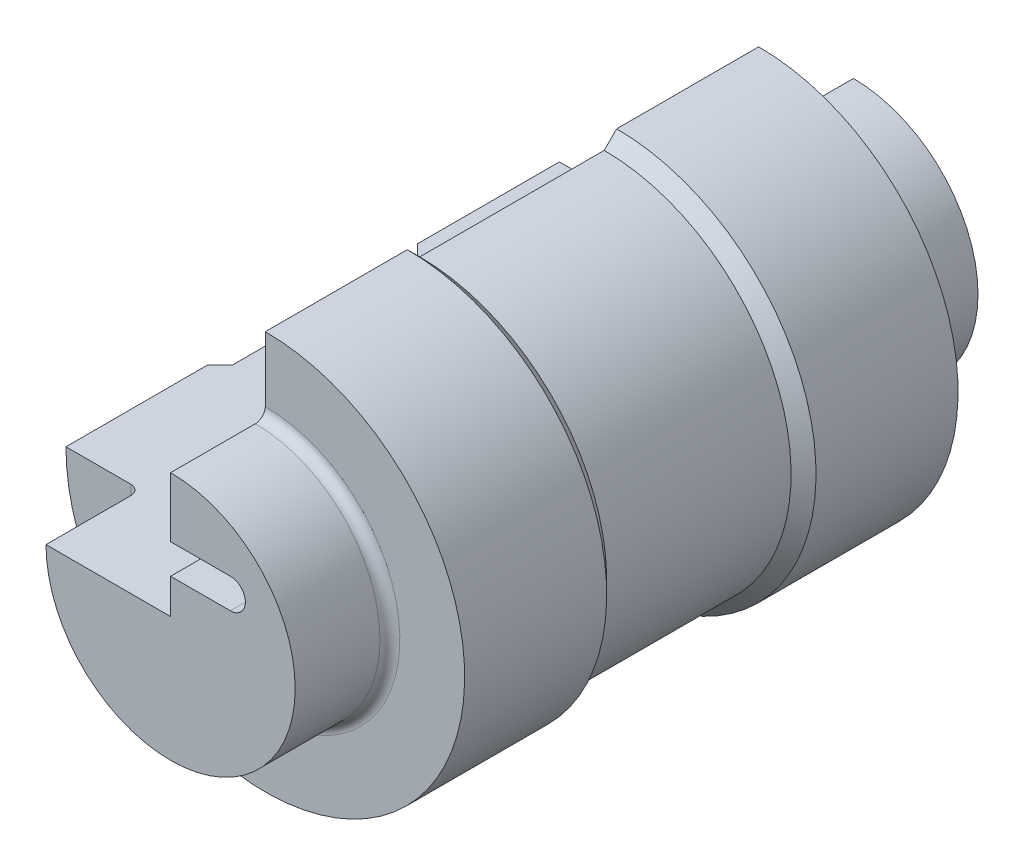
ISO-10303-21;
HEADER;
FILE_DESCRIPTION(('STEP AP214'),'2;1');
FILE_NAME('part.step','',(''),(''),'','','');
FILE_SCHEMA(('AUTOMOTIVE_DESIGN { 1 0 10303 214 1 1 1 1 }'));
ENDSEC;
DATA;
#1=APPLICATION_CONTEXT('core data for automotive mechanical design processes');
#2=APPLICATION_PROTOCOL_DEFINITION('international standard','automotive_design',2000,#1);
#3=PRODUCT_CONTEXT('',#1,'mechanical');
#4=PRODUCT('Part','Part','',(#3));
#5=PRODUCT_RELATED_PRODUCT_CATEGORY('part','',(#4));
#6=PRODUCT_DEFINITION_FORMATION('','',#4);
#7=PRODUCT_DEFINITION_CONTEXT('part definition',#1,'design');
#8=PRODUCT_DEFINITION('design','',#6,#7);
#9=PRODUCT_DEFINITION_SHAPE('','',#8);
#10=(LENGTH_UNIT() NAMED_UNIT(*) SI_UNIT(.MILLI.,.METRE.));
#11=(NAMED_UNIT(*) PLANE_ANGLE_UNIT() SI_UNIT($,.RADIAN.));
#12=(NAMED_UNIT(*) SI_UNIT($,.STERADIAN.) SOLID_ANGLE_UNIT());
#13=UNCERTAINTY_MEASURE_WITH_UNIT(LENGTH_MEASURE(1.E-05),#10,'distance_accuracy_value','');
#14=(GEOMETRIC_REPRESENTATION_CONTEXT(3) GLOBAL_UNCERTAINTY_ASSIGNED_CONTEXT((#13)) GLOBAL_UNIT_ASSIGNED_CONTEXT((#10,
#11,#12)) REPRESENTATION_CONTEXT('',''));
#15=CARTESIAN_POINT('',(0.,0.,0.));
#16=DIRECTION('',(0.,0.,1.));
#17=DIRECTION('',(1.,0.,0.));
#18=AXIS2_PLACEMENT_3D('',#15,#16,#17);
#19=CARTESIAN_POINT('',(0.,0.,-68.5));
#20=DIRECTION('',(1.,0.,0.));
#21=DIRECTION('',(0.,0.,-1.));
#22=AXIS2_PLACEMENT_3D('',#19,#20,#21);
#23=PLANE('',#22);
#24=DIRECTION('',(0.,1.,0.));
#25=VECTOR('',#24,1.);
#26=CARTESIAN_POINT('',(0.,0.,68.5));
#27=LINE('',#26,#25);
#28=CARTESIAN_POINT('',(0.,0.,68.5));
#29=VERTEX_POINT('',#28);
#30=CARTESIAN_POINT('',(0.,7.,68.5));
#31=VERTEX_POINT('',#30);
#32=EDGE_CURVE('E205',#29,#31,#27,.T.);
#33=ORIENTED_EDGE('',*,*,#32,.T.);
#34=DIRECTION('',(0.,0.,1.));
#35=VECTOR('',#34,1.);
#36=CARTESIAN_POINT('',(0.,7.,-68.5));
#37=LINE('',#36,#35);
#38=CARTESIAN_POINT('',(0.,7.,-68.5));
#39=VERTEX_POINT('',#38);
#40=EDGE_CURVE('E176',#39,#31,#37,.T.);
#41=ORIENTED_EDGE('',*,*,#40,.F.);
#42=DIRECTION('',(0.,1.,0.));
#43=VECTOR('',#42,1.);
#44=CARTESIAN_POINT('',(0.,0.,-68.5));
#45=LINE('',#44,#43);
#46=CARTESIAN_POINT('',(0.,0.,-68.5));
#47=VERTEX_POINT('',#46);
#48=EDGE_CURVE('E212',#47,#39,#45,.T.);
#49=ORIENTED_EDGE('',*,*,#48,.F.);
#50=DIRECTION('',(0.,0.,1.));
#51=VECTOR('',#50,1.);
#52=CARTESIAN_POINT('',(0.,0.,-68.5));
#53=LINE('',#52,#51);
#54=EDGE_CURVE('E218',#47,#29,#53,.T.);
#55=ORIENTED_EDGE('',*,*,#54,.T.);
#56=EDGE_LOOP('',(#33,#41,#49,#55));
#57=FACE_BOUND('',#56,.T.);
#58=ADVANCED_FACE('F39',(#57),#23,.F.);
#59=CARTESIAN_POINT('',(0.,0.,-68.5));
#60=DIRECTION('',(0.,0.,1.));
#61=DIRECTION('',(1.,0.,0.));
#62=AXIS2_PLACEMENT_3D('',#59,#60,#61);
#63=PLANE('',#62);
#64=ORIENTED_EDGE('',*,*,#48,.T.);
#65=DIRECTION('',(1.,0.,0.));
#66=VECTOR('',#65,1.);
#67=CARTESIAN_POINT('',(0.,7.,-68.5));
#68=LINE('',#67,#66);
#69=CARTESIAN_POINT('',(12.,7.,-68.5));
#70=VERTEX_POINT('',#69);
#71=EDGE_CURVE('E187',#39,#70,#68,.T.);
#72=ORIENTED_EDGE('',*,*,#71,.T.);
#73=CARTESIAN_POINT('',(12.,10.,-68.5));
#74=DIRECTION('',(0.,0.,1.));
#75=DIRECTION('',(1.,0.,0.));
#76=AXIS2_PLACEMENT_3D('',#73,#74,#75);
#77=CIRCLE('',#76,3.);
#78=CARTESIAN_POINT('',(12.,13.,-68.5));
#79=VERTEX_POINT('',#78);
#80=EDGE_CURVE('E165',#70,#79,#77,.T.);
#81=ORIENTED_EDGE('',*,*,#80,.T.);
#82=DIRECTION('',(-1.,0.,0.));
#83=VECTOR('',#82,1.);
#84=CARTESIAN_POINT('',(0.,13.,-68.5));
#85=LINE('',#84,#83);
#86=CARTESIAN_POINT('',(0.,13.,-68.5));
#87=VERTEX_POINT('',#86);
#88=EDGE_CURVE('E170',#79,#87,#85,.T.);
#89=ORIENTED_EDGE('',*,*,#88,.T.);
#90=CARTESIAN_POINT('',(0.,25.,-68.5));
#91=VERTEX_POINT('',#90);
#92=EDGE_CURVE('E211',#87,#91,#45,.T.);
#93=ORIENTED_EDGE('',*,*,#92,.T.);
#94=CARTESIAN_POINT('',(0.,0.,-68.5));
#95=DIRECTION('',(0.,0.,1.));
#96=DIRECTION('',(1.,0.,0.));
#97=AXIS2_PLACEMENT_3D('',#94,#95,#96);
#98=CIRCLE('',#97,25.);
#99=CARTESIAN_POINT('',(-25.,0.,-68.5));
#100=VERTEX_POINT('',#99);
#101=EDGE_CURVE('E302',#100,#91,#98,.T.);
#102=ORIENTED_EDGE('',*,*,#101,.F.);
#103=DIRECTION('',(1.,0.,0.));
#104=VECTOR('',#103,1.);
#105=CARTESIAN_POINT('',(0.,0.,-68.5));
#106=LINE('',#105,#104);
#107=EDGE_CURVE('E63',#100,#47,#106,.T.);
#108=ORIENTED_EDGE('',*,*,#107,.T.);
#109=EDGE_LOOP('',(#64,#72,#81,#89,#93,#102,#108));
#110=FACE_BOUND('',#109,.T.);
#111=ADVANCED_FACE('F41',(#110),#63,.F.);
#112=CARTESIAN_POINT('',(0.,0.,68.5));
#113=DIRECTION('',(0.,0.,-1.));
#114=DIRECTION('',(-1.,0.,0.));
#115=AXIS2_PLACEMENT_3D('',#112,#113,#114);
#116=PLANE('',#115);
#117=CARTESIAN_POINT('',(12.,10.,68.5));
#118=DIRECTION('',(0.,0.,1.));
#119=DIRECTION('',(1.,0.,0.));
#120=AXIS2_PLACEMENT_3D('',#117,#118,#119);
#121=CIRCLE('',#120,3.);
#122=CARTESIAN_POINT('',(12.,7.,68.5));
#123=VERTEX_POINT('',#122);
#124=CARTESIAN_POINT('',(12.,13.,68.5));
#125=VERTEX_POINT('',#124);
#126=EDGE_CURVE('E163',#123,#125,#121,.T.);
#127=ORIENTED_EDGE('',*,*,#126,.F.);
#128=DIRECTION('',(1.,0.,0.));
#129=VECTOR('',#128,1.);
#130=CARTESIAN_POINT('',(0.,7.,68.5));
#131=LINE('',#130,#129);
#132=EDGE_CURVE('E173',#31,#123,#131,.T.);
#133=ORIENTED_EDGE('',*,*,#132,.F.);
#134=ORIENTED_EDGE('',*,*,#32,.F.);
#135=DIRECTION('',(1.,0.,0.));
#136=VECTOR('',#135,1.);
#137=CARTESIAN_POINT('',(0.,0.,68.5));
#138=LINE('',#137,#136);
#139=CARTESIAN_POINT('',(-25.,0.,68.5));
#140=VERTEX_POINT('',#139);
#141=EDGE_CURVE('E208',#140,#29,#138,.T.);
#142=ORIENTED_EDGE('',*,*,#141,.F.);
#143=CARTESIAN_POINT('',(0.,0.,68.5));
#144=DIRECTION('',(0.,0.,1.));
#145=DIRECTION('',(1.,0.,0.));
#146=AXIS2_PLACEMENT_3D('',#143,#144,#145);
#147=CIRCLE('',#146,25.);
#148=CARTESIAN_POINT('',(0.,25.,68.5));
#149=VERTEX_POINT('',#148);
#150=EDGE_CURVE('E346',#140,#149,#147,.T.);
#151=ORIENTED_EDGE('',*,*,#150,.T.);
#152=CARTESIAN_POINT('',(0.,13.,68.5));
#153=VERTEX_POINT('',#152);
#154=EDGE_CURVE('E199',#153,#149,#27,.T.);
#155=ORIENTED_EDGE('',*,*,#154,.F.);
#156=DIRECTION('',(-1.,0.,0.));
#157=VECTOR('',#156,1.);
#158=CARTESIAN_POINT('',(0.,13.,68.5));
#159=LINE('',#158,#157);
#160=EDGE_CURVE('E55',#125,#153,#159,.T.);
#161=ORIENTED_EDGE('',*,*,#160,.F.);
#162=EDGE_LOOP('',(#127,#133,#134,#142,#151,#155,#161));
#163=FACE_BOUND('',#162,.T.);
#164=ADVANCED_FACE('F182',(#163),#116,.F.);
#165=CARTESIAN_POINT('',(0.,0.,68.5));
#166=DIRECTION('',(0.,0.,1.));
#167=DIRECTION('',(1.,0.,0.));
#168=AXIS2_PLACEMENT_3D('',#165,#166,#167);
#169=CYLINDRICAL_SURFACE('',#168,25.);
#170=CARTESIAN_POINT('',(0.,0.,51.5));
#171=DIRECTION('',(0.,0.,1.));
#172=DIRECTION('',(1.,0.,0.));
#173=AXIS2_PLACEMENT_3D('',#170,#171,#172);
#174=CIRCLE('',#173,25.);
#175=CARTESIAN_POINT('',(-25.,0.,51.5));
#176=VERTEX_POINT('',#175);
#177=CARTESIAN_POINT('',(0.,25.,51.5));
#178=VERTEX_POINT('',#177);
#179=EDGE_CURVE('E342',#176,#178,#174,.T.);
#180=ORIENTED_EDGE('',*,*,#179,.T.);
#181=DIRECTION('',(0.,0.,1.));
#182=VECTOR('',#181,1.);
#183=CARTESIAN_POINT('',(0.,25.,68.5));
#184=LINE('',#183,#182);
#185=EDGE_CURVE('E298',#178,#149,#184,.T.);
#186=ORIENTED_EDGE('',*,*,#185,.T.);
#187=ORIENTED_EDGE('',*,*,#150,.F.);
#188=DIRECTION('',(0.,0.,1.));
#189=VECTOR('',#188,1.);
#190=CARTESIAN_POINT('',(-25.,0.,68.5));
#191=LINE('',#190,#189);
#192=EDGE_CURVE('E258',#140,#176,#191,.F.);
#193=ORIENTED_EDGE('',*,*,#192,.T.);
#194=EDGE_LOOP('',(#180,#186,#187,#193));
#195=FACE_BOUND('',#194,.T.);
#196=ADVANCED_FACE('F392',(#195),#169,.T.);
#197=CARTESIAN_POINT('',(0.,0.,51.5));
#198=DIRECTION('',(0.,0.,1.));
#199=DIRECTION('',(1.,0.,0.));
#200=AXIS2_PLACEMENT_3D('',#197,#198,#199);
#201=TOROIDAL_SURFACE('',#200,27.,2.);
#202=CARTESIAN_POINT('',(0.,0.,49.5));
#203=DIRECTION('',(0.,0.,1.));
#204=DIRECTION('',(1.,0.,0.));
#205=AXIS2_PLACEMENT_3D('',#202,#203,#204);
#206=CIRCLE('',#205,27.);
#207=CARTESIAN_POINT('',(-27.,0.,49.5));
#208=VERTEX_POINT('',#207);
#209=CARTESIAN_POINT('',(0.,27.,49.5));
#210=VERTEX_POINT('',#209);
#211=EDGE_CURVE('E338',#208,#210,#206,.T.);
#212=ORIENTED_EDGE('',*,*,#211,.T.);
#213=CARTESIAN_POINT('',(0.,27.,51.5));
#214=DIRECTION('',(1.,0.,0.));
#215=DIRECTION('',(0.,0.,-1.));
#216=AXIS2_PLACEMENT_3D('',#213,#214,#215);
#217=CIRCLE('',#216,2.);
#218=EDGE_CURVE('E294',#210,#178,#217,.F.);
#219=ORIENTED_EDGE('',*,*,#218,.T.);
#220=ORIENTED_EDGE('',*,*,#179,.F.);
#221=CARTESIAN_POINT('',(-27.,0.,51.5));
#222=DIRECTION('',(0.,-1.,0.));
#223=DIRECTION('',(0.,0.,-1.));
#224=AXIS2_PLACEMENT_3D('',#221,#222,#223);
#225=CIRCLE('',#224,2.);
#226=EDGE_CURVE('E254',#176,#208,#225,.F.);
#227=ORIENTED_EDGE('',*,*,#226,.T.);
#228=EDGE_LOOP('',(#212,#219,#220,#227));
#229=FACE_BOUND('',#228,.T.);
#230=ADVANCED_FACE('F387',(#229),#201,.F.);
#231=CARTESIAN_POINT('',(0.,27.,49.5));
#232=DIRECTION('',(0.,0.,-1.));
#233=DIRECTION('',(-1.,0.,0.));
#234=AXIS2_PLACEMENT_3D('',#231,#232,#233);
#235=PLANE('',#234);
#236=CARTESIAN_POINT('',(0.,0.,49.5));
#237=DIRECTION('',(0.,0.,1.));
#238=DIRECTION('',(1.,0.,0.));
#239=AXIS2_PLACEMENT_3D('',#236,#237,#238);
#240=CIRCLE('',#239,40.);
#241=CARTESIAN_POINT('',(-40.,0.,49.5));
#242=VERTEX_POINT('',#241);
#243=CARTESIAN_POINT('',(0.,40.,49.5));
#244=VERTEX_POINT('',#243);
#245=EDGE_CURVE('E334',#242,#244,#240,.T.);
#246=ORIENTED_EDGE('',*,*,#245,.T.);
#247=DIRECTION('',(0.,-1.,0.));
#248=VECTOR('',#247,1.);
#249=CARTESIAN_POINT('',(0.,27.,49.5));
#250=LINE('',#249,#248);
#251=EDGE_CURVE('E290',#244,#210,#250,.T.);
#252=ORIENTED_EDGE('',*,*,#251,.T.);
#253=ORIENTED_EDGE('',*,*,#211,.F.);
#254=DIRECTION('',(-1.,0.,0.));
#255=VECTOR('',#254,1.);
#256=CARTESIAN_POINT('',(0.,0.,49.5));
#257=LINE('',#256,#255);
#258=EDGE_CURVE('E250',#208,#242,#257,.T.);
#259=ORIENTED_EDGE('',*,*,#258,.T.);
#260=EDGE_LOOP('',(#246,#252,#253,#259));
#261=FACE_BOUND('',#260,.T.);
#262=ADVANCED_FACE('F385',(#261),#235,.F.);
#263=CARTESIAN_POINT('',(0.,0.,68.5));
#264=DIRECTION('',(0.,0.,1.));
#265=DIRECTION('',(1.,0.,0.));
#266=AXIS2_PLACEMENT_3D('',#263,#264,#265);
#267=CYLINDRICAL_SURFACE('',#266,40.);
#268=CARTESIAN_POINT('',(0.,0.,21.));
#269=DIRECTION('',(0.,0.,1.));
#270=DIRECTION('',(1.,0.,0.));
#271=AXIS2_PLACEMENT_3D('',#268,#269,#270);
#272=CIRCLE('',#271,40.);
#273=CARTESIAN_POINT('',(-40.,0.,21.));
#274=VERTEX_POINT('',#273);
#275=CARTESIAN_POINT('',(0.,40.,21.));
#276=VERTEX_POINT('',#275);
#277=EDGE_CURVE('E330',#274,#276,#272,.T.);
#278=ORIENTED_EDGE('',*,*,#277,.T.);
#279=DIRECTION('',(0.,0.,1.));
#280=VECTOR('',#279,1.);
#281=CARTESIAN_POINT('',(0.,40.,68.5));
#282=LINE('',#281,#280);
#283=EDGE_CURVE('E286',#276,#244,#282,.T.);
#284=ORIENTED_EDGE('',*,*,#283,.T.);
#285=ORIENTED_EDGE('',*,*,#245,.F.);
#286=DIRECTION('',(0.,0.,1.));
#287=VECTOR('',#286,1.);
#288=CARTESIAN_POINT('',(-40.,0.,68.5));
#289=LINE('',#288,#287);
#290=EDGE_CURVE('E246',#242,#274,#289,.F.);
#291=ORIENTED_EDGE('',*,*,#290,.T.);
#292=EDGE_LOOP('',(#278,#284,#285,#291));
#293=FACE_BOUND('',#292,.T.);
#294=ADVANCED_FACE('F381',(#293),#267,.T.);
#295=CARTESIAN_POINT('',(0.,0.,18.5));
#296=DIRECTION('',(0.,0.,1.));
#297=DIRECTION('',(1.,0.,0.));
#298=AXIS2_PLACEMENT_3D('',#295,#296,#297);
#299=CONICAL_SURFACE('',#298,37.5,0.785398163397447);
#300=CARTESIAN_POINT('',(0.,0.,18.5));
#301=DIRECTION('',(0.,0.,1.));
#302=DIRECTION('',(1.,0.,0.));
#303=AXIS2_PLACEMENT_3D('',#300,#301,#302);
#304=CIRCLE('',#303,37.5);
#305=CARTESIAN_POINT('',(-37.5,0.,18.5));
#306=VERTEX_POINT('',#305);
#307=CARTESIAN_POINT('',(0.,37.5,18.5));
#308=VERTEX_POINT('',#307);
#309=EDGE_CURVE('E326',#306,#308,#304,.T.);
#310=ORIENTED_EDGE('',*,*,#309,.T.);
#311=DIRECTION('',(0.,0.707106781186547,0.707106781186548));
#312=VECTOR('',#311,1.);
#313=CARTESIAN_POINT('',(0.,0.,-19.0000000000001));
#314=LINE('',#313,#312);
#315=EDGE_CURVE('E282',#308,#276,#314,.T.);
#316=ORIENTED_EDGE('',*,*,#315,.T.);
#317=ORIENTED_EDGE('',*,*,#277,.F.);
#318=DIRECTION('',(0.707106781186547,0.,-0.707106781186548));
#319=VECTOR('',#318,1.);
#320=CARTESIAN_POINT('',(0.,0.,-19.0000000000001));
#321=LINE('',#320,#319);
#322=EDGE_CURVE('E242',#274,#306,#321,.T.);
#323=ORIENTED_EDGE('',*,*,#322,.T.);
#324=EDGE_LOOP('',(#310,#316,#317,#323));
#325=FACE_BOUND('',#324,.T.);
#326=ADVANCED_FACE('F379',(#325),#299,.T.);
#327=CARTESIAN_POINT('',(0.,0.,68.5));
#328=DIRECTION('',(0.,0.,1.));
#329=DIRECTION('',(1.,0.,0.));
#330=AXIS2_PLACEMENT_3D('',#327,#328,#329);
#331=CYLINDRICAL_SURFACE('',#330,37.5);
#332=CARTESIAN_POINT('',(0.,0.,-18.5));
#333=DIRECTION('',(0.,0.,1.));
#334=DIRECTION('',(1.,0.,0.));
#335=AXIS2_PLACEMENT_3D('',#332,#333,#334);
#336=CIRCLE('',#335,37.5);
#337=CARTESIAN_POINT('',(-37.5,0.,-18.5));
#338=VERTEX_POINT('',#337);
#339=CARTESIAN_POINT('',(0.,37.5,-18.5));
#340=VERTEX_POINT('',#339);
#341=EDGE_CURVE('E322',#338,#340,#336,.T.);
#342=ORIENTED_EDGE('',*,*,#341,.T.);
#343=DIRECTION('',(0.,0.,1.));
#344=VECTOR('',#343,1.);
#345=CARTESIAN_POINT('',(0.,37.5,68.5));
#346=LINE('',#345,#344);
#347=EDGE_CURVE('E278',#340,#308,#346,.T.);
#348=ORIENTED_EDGE('',*,*,#347,.T.);
#349=ORIENTED_EDGE('',*,*,#309,.F.);
#350=DIRECTION('',(0.,0.,1.));
#351=VECTOR('',#350,1.);
#352=CARTESIAN_POINT('',(-37.5,0.,68.5));
#353=LINE('',#352,#351);
#354=EDGE_CURVE('E238',#306,#338,#353,.F.);
#355=ORIENTED_EDGE('',*,*,#354,.T.);
#356=EDGE_LOOP('',(#342,#348,#349,#355));
#357=FACE_BOUND('',#356,.T.);
#358=ADVANCED_FACE('F375',(#357),#331,.T.);
#359=CARTESIAN_POINT('',(0.,0.,-21.));
#360=DIRECTION('',(0.,0.,-1.));
#361=DIRECTION('',(-1.,0.,0.));
#362=AXIS2_PLACEMENT_3D('',#359,#360,#361);
#363=CONICAL_SURFACE('',#362,40.,0.785398163397444);
#364=CARTESIAN_POINT('',(0.,0.,-21.));
#365=DIRECTION('',(0.,0.,1.));
#366=DIRECTION('',(1.,0.,0.));
#367=AXIS2_PLACEMENT_3D('',#364,#365,#366);
#368=CIRCLE('',#367,40.);
#369=CARTESIAN_POINT('',(-40.,0.,-21.));
#370=VERTEX_POINT('',#369);
#371=CARTESIAN_POINT('',(0.,40.,-21.));
#372=VERTEX_POINT('',#371);
#373=EDGE_CURVE('E318',#370,#372,#368,.T.);
#374=ORIENTED_EDGE('',*,*,#373,.T.);
#375=DIRECTION('',(0.,-0.707106781186545,0.70710678118655));
#376=VECTOR('',#375,1.);
#377=CARTESIAN_POINT('',(0.,0.,19.0000000000003));
#378=LINE('',#377,#376);
#379=EDGE_CURVE('E274',#372,#340,#378,.T.);
#380=ORIENTED_EDGE('',*,*,#379,.T.);
#381=ORIENTED_EDGE('',*,*,#341,.F.);
#382=DIRECTION('',(-0.707106781186545,0.,-0.70710678118655));
#383=VECTOR('',#382,1.);
#384=CARTESIAN_POINT('',(0.,0.,19.0000000000003));
#385=LINE('',#384,#383);
#386=EDGE_CURVE('E234',#338,#370,#385,.T.);
#387=ORIENTED_EDGE('',*,*,#386,.T.);
#388=EDGE_LOOP('',(#374,#380,#381,#387));
#389=FACE_BOUND('',#388,.T.);
#390=ADVANCED_FACE('F373',(#389),#363,.T.);
#391=CARTESIAN_POINT('',(0.,0.,68.5));
#392=DIRECTION('',(0.,0.,1.));
#393=DIRECTION('',(1.,0.,0.));
#394=AXIS2_PLACEMENT_3D('',#391,#392,#393);
#395=CYLINDRICAL_SURFACE('',#394,40.);
#396=CARTESIAN_POINT('',(0.,0.,-49.5));
#397=DIRECTION('',(0.,0.,1.));
#398=DIRECTION('',(1.,0.,0.));
#399=AXIS2_PLACEMENT_3D('',#396,#397,#398);
#400=CIRCLE('',#399,40.);
#401=CARTESIAN_POINT('',(-40.,0.,-49.5));
#402=VERTEX_POINT('',#401);
#403=CARTESIAN_POINT('',(0.,40.,-49.5));
#404=VERTEX_POINT('',#403);
#405=EDGE_CURVE('E314',#402,#404,#400,.T.);
#406=ORIENTED_EDGE('',*,*,#405,.T.);
#407=DIRECTION('',(0.,0.,1.));
#408=VECTOR('',#407,1.);
#409=CARTESIAN_POINT('',(0.,40.,68.5));
#410=LINE('',#409,#408);
#411=EDGE_CURVE('E270',#404,#372,#410,.T.);
#412=ORIENTED_EDGE('',*,*,#411,.T.);
#413=ORIENTED_EDGE('',*,*,#373,.F.);
#414=DIRECTION('',(0.,0.,1.));
#415=VECTOR('',#414,1.);
#416=CARTESIAN_POINT('',(-40.,0.,68.5));
#417=LINE('',#416,#415);
#418=EDGE_CURVE('E230',#370,#402,#417,.F.);
#419=ORIENTED_EDGE('',*,*,#418,.T.);
#420=EDGE_LOOP('',(#406,#412,#413,#419));
#421=FACE_BOUND('',#420,.T.);
#422=ADVANCED_FACE('F369',(#421),#395,.T.);
#423=CARTESIAN_POINT('',(0.,27.,-49.5));
#424=DIRECTION('',(0.,0.,1.));
#425=DIRECTION('',(1.,0.,0.));
#426=AXIS2_PLACEMENT_3D('',#423,#424,#425);
#427=PLANE('',#426);
#428=CARTESIAN_POINT('',(0.,0.,-49.5));
#429=DIRECTION('',(0.,0.,1.));
#430=DIRECTION('',(1.,0.,0.));
#431=AXIS2_PLACEMENT_3D('',#428,#429,#430);
#432=CIRCLE('',#431,27.);
#433=CARTESIAN_POINT('',(-27.,0.,-49.5));
#434=VERTEX_POINT('',#433);
#435=CARTESIAN_POINT('',(0.,27.,-49.5));
#436=VERTEX_POINT('',#435);
#437=EDGE_CURVE('E310',#434,#436,#432,.T.);
#438=ORIENTED_EDGE('',*,*,#437,.T.);
#439=DIRECTION('',(0.,1.,0.));
#440=VECTOR('',#439,1.);
#441=CARTESIAN_POINT('',(0.,27.,-49.5));
#442=LINE('',#441,#440);
#443=EDGE_CURVE('E266',#436,#404,#442,.T.);
#444=ORIENTED_EDGE('',*,*,#443,.T.);
#445=ORIENTED_EDGE('',*,*,#405,.F.);
#446=DIRECTION('',(1.,0.,0.));
#447=VECTOR('',#446,1.);
#448=CARTESIAN_POINT('',(0.,0.,-49.5));
#449=LINE('',#448,#447);
#450=EDGE_CURVE('E226',#402,#434,#449,.T.);
#451=ORIENTED_EDGE('',*,*,#450,.T.);
#452=EDGE_LOOP('',(#438,#444,#445,#451));
#453=FACE_BOUND('',#452,.T.);
#454=ADVANCED_FACE('F367',(#453),#427,.F.);
#455=CARTESIAN_POINT('',(0.,0.,-51.5));
#456=DIRECTION('',(0.,0.,1.));
#457=DIRECTION('',(1.,0.,0.));
#458=AXIS2_PLACEMENT_3D('',#455,#456,#457);
#459=TOROIDAL_SURFACE('',#458,27.,2.);
#460=CARTESIAN_POINT('',(0.,0.,-51.5));
#461=DIRECTION('',(0.,0.,1.));
#462=DIRECTION('',(1.,0.,0.));
#463=AXIS2_PLACEMENT_3D('',#460,#461,#462);
#464=CIRCLE('',#463,25.);
#465=CARTESIAN_POINT('',(-25.,0.,-51.5));
#466=VERTEX_POINT('',#465);
#467=CARTESIAN_POINT('',(0.,25.,-51.5));
#468=VERTEX_POINT('',#467);
#469=EDGE_CURVE('E306',#466,#468,#464,.T.);
#470=ORIENTED_EDGE('',*,*,#469,.T.);
#471=CARTESIAN_POINT('',(0.,27.,-51.5));
#472=DIRECTION('',(1.,0.,0.));
#473=DIRECTION('',(0.,0.,-1.));
#474=AXIS2_PLACEMENT_3D('',#471,#472,#473);
#475=CIRCLE('',#474,2.);
#476=EDGE_CURVE('E262',#468,#436,#475,.F.);
#477=ORIENTED_EDGE('',*,*,#476,.T.);
#478=ORIENTED_EDGE('',*,*,#437,.F.);
#479=CARTESIAN_POINT('',(-27.,0.,-51.5));
#480=DIRECTION('',(0.,-1.,0.));
#481=DIRECTION('',(0.,0.,-1.));
#482=AXIS2_PLACEMENT_3D('',#479,#480,#481);
#483=CIRCLE('',#482,2.);
#484=EDGE_CURVE('E222',#434,#466,#483,.F.);
#485=ORIENTED_EDGE('',*,*,#484,.T.);
#486=EDGE_LOOP('',(#470,#477,#478,#485));
#487=FACE_BOUND('',#486,.T.);
#488=ADVANCED_FACE('F362',(#487),#459,.F.);
#489=CARTESIAN_POINT('',(0.,0.,68.5));
#490=DIRECTION('',(0.,0.,1.));
#491=DIRECTION('',(1.,0.,0.));
#492=AXIS2_PLACEMENT_3D('',#489,#490,#491);
#493=CYLINDRICAL_SURFACE('',#492,25.);
#494=ORIENTED_EDGE('',*,*,#101,.T.);
#495=DIRECTION('',(0.,0.,1.));
#496=VECTOR('',#495,1.);
#497=CARTESIAN_POINT('',(0.,25.,68.5));
#498=LINE('',#497,#496);
#499=EDGE_CURVE('E11',#91,#468,#498,.T.);
#500=ORIENTED_EDGE('',*,*,#499,.T.);
#501=ORIENTED_EDGE('',*,*,#469,.F.);
#502=DIRECTION('',(0.,0.,1.));
#503=VECTOR('',#502,1.);
#504=CARTESIAN_POINT('',(-25.,0.,68.5));
#505=LINE('',#504,#503);
#506=EDGE_CURVE('E48',#466,#100,#505,.F.);
#507=ORIENTED_EDGE('',*,*,#506,.T.);
#508=EDGE_LOOP('',(#494,#500,#501,#507));
#509=FACE_BOUND('',#508,.T.);
#510=ADVANCED_FACE('F353',(#509),#493,.T.);
#511=ORIENTED_EDGE('',*,*,#92,.F.);
#512=DIRECTION('',(0.,0.,1.));
#513=VECTOR('',#512,1.);
#514=CARTESIAN_POINT('',(0.,13.,-68.5));
#515=LINE('',#514,#513);
#516=EDGE_CURVE('E200',#87,#153,#515,.T.);
#517=ORIENTED_EDGE('',*,*,#516,.T.);
#518=ORIENTED_EDGE('',*,*,#154,.T.);
#519=ORIENTED_EDGE('',*,*,#185,.F.);
#520=ORIENTED_EDGE('',*,*,#218,.F.);
#521=ORIENTED_EDGE('',*,*,#251,.F.);
#522=ORIENTED_EDGE('',*,*,#283,.F.);
#523=ORIENTED_EDGE('',*,*,#315,.F.);
#524=ORIENTED_EDGE('',*,*,#347,.F.);
#525=ORIENTED_EDGE('',*,*,#379,.F.);
#526=ORIENTED_EDGE('',*,*,#411,.F.);
#527=ORIENTED_EDGE('',*,*,#443,.F.);
#528=ORIENTED_EDGE('',*,*,#476,.F.);
#529=ORIENTED_EDGE('',*,*,#499,.F.);
#530=EDGE_LOOP('',(#511,#517,#518,#519,#520,#521,#522,#523,#524,#525,#526,#527,#528,#529));
#531=FACE_BOUND('',#530,.T.);
#532=ADVANCED_FACE('F360',(#531),#23,.F.);
#533=CARTESIAN_POINT('',(0.,0.,-68.5));
#534=DIRECTION('',(0.,-1.,0.));
#535=DIRECTION('',(0.,0.,-1.));
#536=AXIS2_PLACEMENT_3D('',#533,#534,#535);
#537=PLANE('',#536);
#538=ORIENTED_EDGE('',*,*,#141,.T.);
#539=ORIENTED_EDGE('',*,*,#54,.F.);
#540=ORIENTED_EDGE('',*,*,#107,.F.);
#541=ORIENTED_EDGE('',*,*,#506,.F.);
#542=ORIENTED_EDGE('',*,*,#484,.F.);
#543=ORIENTED_EDGE('',*,*,#450,.F.);
#544=ORIENTED_EDGE('',*,*,#418,.F.);
#545=ORIENTED_EDGE('',*,*,#386,.F.);
#546=ORIENTED_EDGE('',*,*,#354,.F.);
#547=ORIENTED_EDGE('',*,*,#322,.F.);
#548=ORIENTED_EDGE('',*,*,#290,.F.);
#549=ORIENTED_EDGE('',*,*,#258,.F.);
#550=ORIENTED_EDGE('',*,*,#226,.F.);
#551=ORIENTED_EDGE('',*,*,#192,.F.);
#552=EDGE_LOOP('',(#538,#539,#540,#541,#542,#543,#544,#545,#546,#547,#548,#549,#550,#551));
#553=FACE_BOUND('',#552,.T.);
#554=ADVANCED_FACE('F364',(#553),#537,.F.);
#555=CARTESIAN_POINT('',(0.,7.,-68.5));
#556=DIRECTION('',(0.,-1.,0.));
#557=DIRECTION('',(0.,0.,-1.));
#558=AXIS2_PLACEMENT_3D('',#555,#556,#557);
#559=PLANE('',#558);
#560=DIRECTION('',(0.,0.,1.));
#561=VECTOR('',#560,1.);
#562=CARTESIAN_POINT('',(12.,7.,-68.5));
#563=LINE('',#562,#561);
#564=EDGE_CURVE('E159',#70,#123,#563,.T.);
#565=ORIENTED_EDGE('',*,*,#564,.F.);
#566=ORIENTED_EDGE('',*,*,#71,.F.);
#567=ORIENTED_EDGE('',*,*,#40,.T.);
#568=ORIENTED_EDGE('',*,*,#132,.T.);
#569=EDGE_LOOP('',(#565,#566,#567,#568));
#570=FACE_BOUND('',#569,.T.);
#571=ADVANCED_FACE('F174',(#570),#559,.F.);
#572=CARTESIAN_POINT('',(0.,13.,-68.5));
#573=DIRECTION('',(0.,1.,0.));
#574=DIRECTION('',(0.,0.,1.));
#575=AXIS2_PLACEMENT_3D('',#572,#573,#574);
#576=PLANE('',#575);
#577=ORIENTED_EDGE('',*,*,#516,.F.);
#578=ORIENTED_EDGE('',*,*,#88,.F.);
#579=DIRECTION('',(0.,0.,1.));
#580=VECTOR('',#579,1.);
#581=CARTESIAN_POINT('',(12.,13.,-68.5));
#582=LINE('',#581,#580);
#583=EDGE_CURVE('E169',#79,#125,#582,.T.);
#584=ORIENTED_EDGE('',*,*,#583,.T.);
#585=ORIENTED_EDGE('',*,*,#160,.T.);
#586=EDGE_LOOP('',(#577,#578,#584,#585));
#587=FACE_BOUND('',#586,.T.);
#588=ADVANCED_FACE('F523',(#587),#576,.F.);
#589=CARTESIAN_POINT('',(12.,10.,-68.5));
#590=DIRECTION('',(0.,0.,1.));
#591=DIRECTION('',(1.,0.,0.));
#592=AXIS2_PLACEMENT_3D('',#589,#590,#591);
#593=CYLINDRICAL_SURFACE('',#592,3.);
#594=ORIENTED_EDGE('',*,*,#583,.F.);
#595=ORIENTED_EDGE('',*,*,#80,.F.);
#596=ORIENTED_EDGE('',*,*,#564,.T.);
#597=ORIENTED_EDGE('',*,*,#126,.T.);
#598=EDGE_LOOP('',(#594,#595,#596,#597));
#599=FACE_BOUND('',#598,.T.);
#600=ADVANCED_FACE('F161',(#599),#593,.F.);
#601=CLOSED_SHELL('',(#58,#111,#164,#196,#230,#262,#294,#326,#358,#390,#422,#454,#488,#510,#532,
#554,#571,#588,#600));
#602=MANIFOLD_SOLID_BREP('B2',#601);
#603=ADVANCED_BREP_SHAPE_REPRESENTATION('',(#18,#602),#14);
#604=SHAPE_DEFINITION_REPRESENTATION(#9,#603);
ENDSEC;
END-ISO-10303-21;
